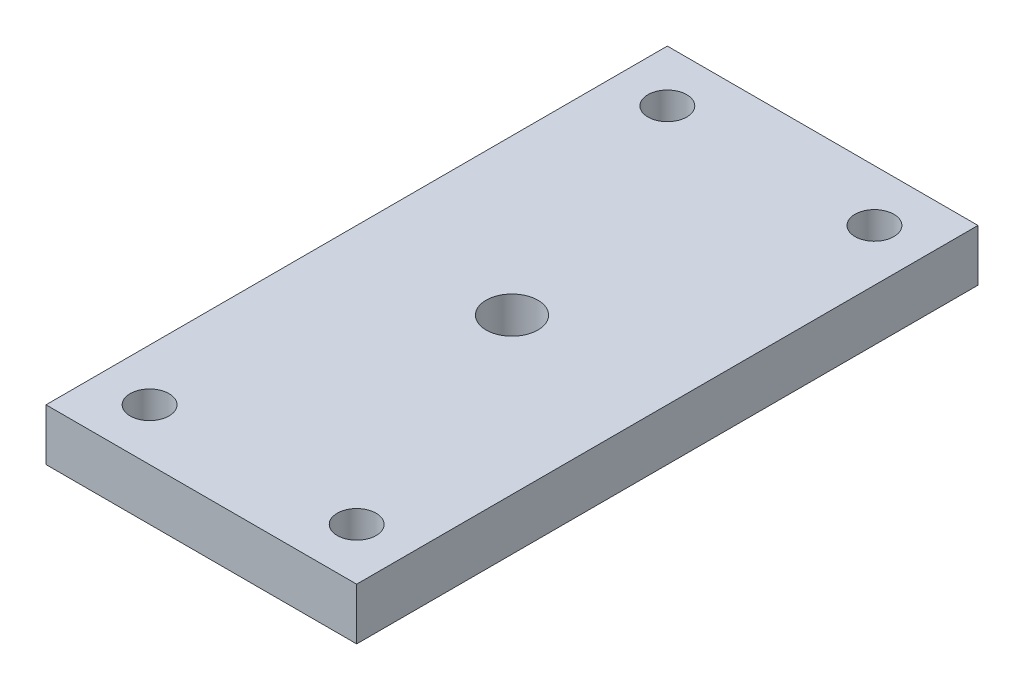
ISO-10303-21;
HEADER;
FILE_DESCRIPTION(('STEP AP214'),'2;1');
FILE_NAME('part.step','',(''),(''),'','','');
FILE_SCHEMA(('AUTOMOTIVE_DESIGN { 1 0 10303 214 1 1 1 1 }'));
ENDSEC;
DATA;
#1=APPLICATION_CONTEXT('core data for automotive mechanical design processes');
#2=APPLICATION_PROTOCOL_DEFINITION('international standard','automotive_design',2000,#1);
#3=PRODUCT_CONTEXT('',#1,'mechanical');
#4=PRODUCT('Part','Part','',(#3));
#5=PRODUCT_RELATED_PRODUCT_CATEGORY('part','',(#4));
#6=PRODUCT_DEFINITION_FORMATION('','',#4);
#7=PRODUCT_DEFINITION_CONTEXT('part definition',#1,'design');
#8=PRODUCT_DEFINITION('design','',#6,#7);
#9=PRODUCT_DEFINITION_SHAPE('','',#8);
#10=(LENGTH_UNIT() NAMED_UNIT(*) SI_UNIT(.MILLI.,.METRE.));
#11=(NAMED_UNIT(*) PLANE_ANGLE_UNIT() SI_UNIT($,.RADIAN.));
#12=(NAMED_UNIT(*) SI_UNIT($,.STERADIAN.) SOLID_ANGLE_UNIT());
#13=UNCERTAINTY_MEASURE_WITH_UNIT(LENGTH_MEASURE(1.E-05),#10,'distance_accuracy_value','');
#14=(GEOMETRIC_REPRESENTATION_CONTEXT(3) GLOBAL_UNCERTAINTY_ASSIGNED_CONTEXT((#13)) GLOBAL_UNIT_ASSIGNED_CONTEXT((#10,
#11,#12)) REPRESENTATION_CONTEXT('',''));
#15=CARTESIAN_POINT('',(0.,0.,0.));
#16=DIRECTION('',(0.,0.,1.));
#17=DIRECTION('',(1.,0.,0.));
#18=AXIS2_PLACEMENT_3D('',#15,#16,#17);
#19=CARTESIAN_POINT('',(0.,12.7,0.));
#20=DIRECTION('',(0.,1.,0.));
#21=DIRECTION('',(0.,0.,1.));
#22=AXIS2_PLACEMENT_3D('',#19,#20,#21);
#23=PLANE('',#22);
#24=CARTESIAN_POINT('',(25.4,12.7,-63.5));
#25=DIRECTION('',(0.,1.,0.));
#26=DIRECTION('',(0.,0.,1.));
#27=AXIS2_PLACEMENT_3D('',#24,#25,#26);
#28=CIRCLE('',#27,4.7625);
#29=CARTESIAN_POINT('',(25.4,12.7,-58.7375));
#30=VERTEX_POINT('',#29);
#31=EDGE_CURVE('E139',#30,#30,#28,.T.);
#32=ORIENTED_EDGE('',*,*,#31,.F.);
#33=EDGE_LOOP('',(#32));
#34=FACE_BOUND('',#33,.T.);
#35=CARTESIAN_POINT('',(25.4,12.7,63.5));
#36=DIRECTION('',(0.,1.,0.));
#37=DIRECTION('',(0.,0.,1.));
#38=AXIS2_PLACEMENT_3D('',#35,#36,#37);
#39=CIRCLE('',#38,4.7625);
#40=CARTESIAN_POINT('',(25.4,12.7,68.2625));
#41=VERTEX_POINT('',#40);
#42=EDGE_CURVE('E145',#41,#41,#39,.T.);
#43=ORIENTED_EDGE('',*,*,#42,.F.);
#44=EDGE_LOOP('',(#43));
#45=FACE_BOUND('',#44,.T.);
#46=CARTESIAN_POINT('',(-25.4,12.7,63.5));
#47=DIRECTION('',(0.,1.,0.));
#48=DIRECTION('',(0.,0.,1.));
#49=AXIS2_PLACEMENT_3D('',#46,#47,#48);
#50=CIRCLE('',#49,4.7625);
#51=CARTESIAN_POINT('',(-25.4,12.7,68.2625));
#52=VERTEX_POINT('',#51);
#53=EDGE_CURVE('E133',#52,#52,#50,.T.);
#54=ORIENTED_EDGE('',*,*,#53,.F.);
#55=EDGE_LOOP('',(#54));
#56=FACE_BOUND('',#55,.T.);
#57=CARTESIAN_POINT('',(-25.4,12.7,-63.5));
#58=DIRECTION('',(0.,1.,0.));
#59=DIRECTION('',(0.,0.,1.));
#60=AXIS2_PLACEMENT_3D('',#57,#58,#59);
#61=CIRCLE('',#60,4.7625);
#62=CARTESIAN_POINT('',(-25.4,12.7,-58.7375));
#63=VERTEX_POINT('',#62);
#64=EDGE_CURVE('E130',#63,#63,#61,.T.);
#65=ORIENTED_EDGE('',*,*,#64,.F.);
#66=EDGE_LOOP('',(#65));
#67=FACE_BOUND('',#66,.T.);
#68=DIRECTION('',(0.,0.,1.));
#69=VECTOR('',#68,1.);
#70=CARTESIAN_POINT('',(-38.1,12.7,76.1999999999999));
#71=LINE('',#70,#69);
#72=CARTESIAN_POINT('',(-38.1,12.7,-76.2000000000001));
#73=VERTEX_POINT('',#72);
#74=CARTESIAN_POINT('',(-38.1,12.7,76.1999999999999));
#75=VERTEX_POINT('',#74);
#76=EDGE_CURVE('E97',#73,#75,#71,.T.);
#77=ORIENTED_EDGE('',*,*,#76,.T.);
#78=DIRECTION('',(1.,0.,0.));
#79=VECTOR('',#78,1.);
#80=CARTESIAN_POINT('',(38.1,12.7,76.1999999999999));
#81=LINE('',#80,#79);
#82=CARTESIAN_POINT('',(38.1,12.7,76.1999999999999));
#83=VERTEX_POINT('',#82);
#84=EDGE_CURVE('E92',#75,#83,#81,.T.);
#85=ORIENTED_EDGE('',*,*,#84,.T.);
#86=DIRECTION('',(0.,0.,-1.));
#87=VECTOR('',#86,1.);
#88=CARTESIAN_POINT('',(38.1,12.7,76.1999999999999));
#89=LINE('',#88,#87);
#90=CARTESIAN_POINT('',(38.1,12.7,-76.2));
#91=VERTEX_POINT('',#90);
#92=EDGE_CURVE('E95',#83,#91,#89,.T.);
#93=ORIENTED_EDGE('',*,*,#92,.T.);
#94=DIRECTION('',(-1.,0.,0.));
#95=VECTOR('',#94,1.);
#96=CARTESIAN_POINT('',(38.1,12.7,-76.2));
#97=LINE('',#96,#95);
#98=EDGE_CURVE('E62',#91,#73,#97,.T.);
#99=ORIENTED_EDGE('',*,*,#98,.T.);
#100=EDGE_LOOP('',(#77,#85,#93,#99));
#101=FACE_BOUND('',#100,.T.);
#102=CARTESIAN_POINT('',(0.,12.7,0.));
#103=DIRECTION('',(0.,1.,0.));
#104=DIRECTION('',(0.,0.,1.));
#105=AXIS2_PLACEMENT_3D('',#102,#103,#104);
#106=CIRCLE('',#105,6.35);
#107=CARTESIAN_POINT('',(0.,12.7,6.34999999999999));
#108=VERTEX_POINT('',#107);
#109=EDGE_CURVE('E112',#108,#108,#106,.T.);
#110=ORIENTED_EDGE('',*,*,#109,.F.);
#111=EDGE_LOOP('',(#110));
#112=FACE_BOUND('',#111,.T.);
#113=ADVANCED_FACE('F45',(#34,#45,#56,#67,#101,#112),#23,.T.);
#114=CARTESIAN_POINT('',(0.,0.,0.));
#115=DIRECTION('',(0.,1.,0.));
#116=DIRECTION('',(0.,0.,1.));
#117=AXIS2_PLACEMENT_3D('',#114,#115,#116);
#118=PLANE('',#117);
#119=CARTESIAN_POINT('',(25.4,0.,-63.5));
#120=DIRECTION('',(0.,1.,0.));
#121=DIRECTION('',(0.,0.,1.));
#122=AXIS2_PLACEMENT_3D('',#119,#120,#121);
#123=CIRCLE('',#122,4.7625);
#124=CARTESIAN_POINT('',(25.4,0.,-58.7375));
#125=VERTEX_POINT('',#124);
#126=EDGE_CURVE('E136',#125,#125,#123,.T.);
#127=ORIENTED_EDGE('',*,*,#126,.T.);
#128=EDGE_LOOP('',(#127));
#129=FACE_BOUND('',#128,.T.);
#130=CARTESIAN_POINT('',(25.4,0.,63.5));
#131=DIRECTION('',(0.,1.,0.));
#132=DIRECTION('',(0.,0.,1.));
#133=AXIS2_PLACEMENT_3D('',#130,#131,#132);
#134=CIRCLE('',#133,4.7625);
#135=CARTESIAN_POINT('',(25.4,0.,68.2625));
#136=VERTEX_POINT('',#135);
#137=EDGE_CURVE('E142',#136,#136,#134,.T.);
#138=ORIENTED_EDGE('',*,*,#137,.T.);
#139=EDGE_LOOP('',(#138));
#140=FACE_BOUND('',#139,.T.);
#141=CARTESIAN_POINT('',(-25.4,0.,63.5));
#142=DIRECTION('',(0.,1.,0.));
#143=DIRECTION('',(0.,0.,1.));
#144=AXIS2_PLACEMENT_3D('',#141,#142,#143);
#145=CIRCLE('',#144,4.7625);
#146=CARTESIAN_POINT('',(-25.4,0.,68.2625));
#147=VERTEX_POINT('',#146);
#148=EDGE_CURVE('E148',#147,#147,#145,.T.);
#149=ORIENTED_EDGE('',*,*,#148,.T.);
#150=EDGE_LOOP('',(#149));
#151=FACE_BOUND('',#150,.T.);
#152=CARTESIAN_POINT('',(-25.4,0.,-63.5));
#153=DIRECTION('',(0.,1.,0.));
#154=DIRECTION('',(0.,0.,1.));
#155=AXIS2_PLACEMENT_3D('',#152,#153,#154);
#156=CIRCLE('',#155,4.7625);
#157=CARTESIAN_POINT('',(-25.4,0.,-58.7375));
#158=VERTEX_POINT('',#157);
#159=EDGE_CURVE('E127',#158,#158,#156,.T.);
#160=ORIENTED_EDGE('',*,*,#159,.T.);
#161=EDGE_LOOP('',(#160));
#162=FACE_BOUND('',#161,.T.);
#163=DIRECTION('',(0.,0.,1.));
#164=VECTOR('',#163,1.);
#165=CARTESIAN_POINT('',(-38.1,0.,76.1999999999999));
#166=LINE('',#165,#164);
#167=CARTESIAN_POINT('',(-38.1,0.,-76.2000000000001));
#168=VERTEX_POINT('',#167);
#169=CARTESIAN_POINT('',(-38.1,0.,76.1999999999999));
#170=VERTEX_POINT('',#169);
#171=EDGE_CURVE('E109',#168,#170,#166,.T.);
#172=ORIENTED_EDGE('',*,*,#171,.F.);
#173=DIRECTION('',(-1.,0.,0.));
#174=VECTOR('',#173,1.);
#175=CARTESIAN_POINT('',(38.1,0.,-76.2));
#176=LINE('',#175,#174);
#177=CARTESIAN_POINT('',(38.1,0.,-76.2));
#178=VERTEX_POINT('',#177);
#179=EDGE_CURVE('E85',#178,#168,#176,.T.);
#180=ORIENTED_EDGE('',*,*,#179,.F.);
#181=DIRECTION('',(0.,0.,-1.));
#182=VECTOR('',#181,1.);
#183=CARTESIAN_POINT('',(38.1,0.,76.1999999999999));
#184=LINE('',#183,#182);
#185=CARTESIAN_POINT('',(38.1,0.,76.1999999999999));
#186=VERTEX_POINT('',#185);
#187=EDGE_CURVE('E79',#186,#178,#184,.T.);
#188=ORIENTED_EDGE('',*,*,#187,.F.);
#189=DIRECTION('',(1.,0.,0.));
#190=VECTOR('',#189,1.);
#191=CARTESIAN_POINT('',(38.1,0.,76.1999999999999));
#192=LINE('',#191,#190);
#193=EDGE_CURVE('E101',#170,#186,#192,.T.);
#194=ORIENTED_EDGE('',*,*,#193,.F.);
#195=EDGE_LOOP('',(#172,#180,#188,#194));
#196=FACE_BOUND('',#195,.T.);
#197=CARTESIAN_POINT('',(0.,0.,0.));
#198=DIRECTION('',(0.,1.,0.));
#199=DIRECTION('',(0.,0.,1.));
#200=AXIS2_PLACEMENT_3D('',#197,#198,#199);
#201=CIRCLE('',#200,6.35);
#202=CARTESIAN_POINT('',(0.,0.,6.34999999999999));
#203=VERTEX_POINT('',#202);
#204=EDGE_CURVE('E124',#203,#203,#201,.T.);
#205=ORIENTED_EDGE('',*,*,#204,.T.);
#206=EDGE_LOOP('',(#205));
#207=FACE_BOUND('',#206,.T.);
#208=ADVANCED_FACE('F120',(#129,#140,#151,#162,#196,#207),#118,.F.);
#209=CARTESIAN_POINT('',(-38.1,12.7,76.1999999999999));
#210=DIRECTION('',(1.,0.,0.));
#211=DIRECTION('',(0.,0.,-1.));
#212=AXIS2_PLACEMENT_3D('',#209,#210,#211);
#213=PLANE('',#212);
#214=ORIENTED_EDGE('',*,*,#171,.T.);
#215=DIRECTION('',(0.,-1.,0.));
#216=VECTOR('',#215,1.);
#217=CARTESIAN_POINT('',(-38.1,12.7,76.1999999999999));
#218=LINE('',#217,#216);
#219=EDGE_CURVE('E11',#75,#170,#218,.T.);
#220=ORIENTED_EDGE('',*,*,#219,.F.);
#221=ORIENTED_EDGE('',*,*,#76,.F.);
#222=DIRECTION('',(0.,-1.,0.));
#223=VECTOR('',#222,1.);
#224=CARTESIAN_POINT('',(-38.1,12.7,-76.2000000000001));
#225=LINE('',#224,#223);
#226=EDGE_CURVE('E105',#73,#168,#225,.T.);
#227=ORIENTED_EDGE('',*,*,#226,.T.);
#228=EDGE_LOOP('',(#214,#220,#221,#227));
#229=FACE_BOUND('',#228,.T.);
#230=ADVANCED_FACE('F47',(#229),#213,.F.);
#231=CARTESIAN_POINT('',(38.1,12.7,76.1999999999999));
#232=DIRECTION('',(0.,0.,-1.));
#233=DIRECTION('',(-1.,0.,0.));
#234=AXIS2_PLACEMENT_3D('',#231,#232,#233);
#235=PLANE('',#234);
#236=ORIENTED_EDGE('',*,*,#193,.T.);
#237=DIRECTION('',(0.,-1.,0.));
#238=VECTOR('',#237,1.);
#239=CARTESIAN_POINT('',(38.1,12.7,76.1999999999999));
#240=LINE('',#239,#238);
#241=EDGE_CURVE('E54',#83,#186,#240,.T.);
#242=ORIENTED_EDGE('',*,*,#241,.F.);
#243=ORIENTED_EDGE('',*,*,#84,.F.);
#244=ORIENTED_EDGE('',*,*,#219,.T.);
#245=EDGE_LOOP('',(#236,#242,#243,#244));
#246=FACE_BOUND('',#245,.T.);
#247=ADVANCED_FACE('F100',(#246),#235,.F.);
#248=CARTESIAN_POINT('',(38.1,12.7,76.1999999999999));
#249=DIRECTION('',(-1.,0.,0.));
#250=DIRECTION('',(0.,0.,1.));
#251=AXIS2_PLACEMENT_3D('',#248,#249,#250);
#252=PLANE('',#251);
#253=ORIENTED_EDGE('',*,*,#187,.T.);
#254=DIRECTION('',(0.,-1.,0.));
#255=VECTOR('',#254,1.);
#256=CARTESIAN_POINT('',(38.1,12.7,-76.2));
#257=LINE('',#256,#255);
#258=EDGE_CURVE('E102',#91,#178,#257,.T.);
#259=ORIENTED_EDGE('',*,*,#258,.F.);
#260=ORIENTED_EDGE('',*,*,#92,.F.);
#261=ORIENTED_EDGE('',*,*,#241,.T.);
#262=EDGE_LOOP('',(#253,#259,#260,#261));
#263=FACE_BOUND('',#262,.T.);
#264=ADVANCED_FACE('F103',(#263),#252,.F.);
#265=CARTESIAN_POINT('',(38.1,12.7,-76.2));
#266=DIRECTION('',(0.,0.,1.));
#267=DIRECTION('',(1.,0.,0.));
#268=AXIS2_PLACEMENT_3D('',#265,#266,#267);
#269=PLANE('',#268);
#270=ORIENTED_EDGE('',*,*,#179,.T.);
#271=ORIENTED_EDGE('',*,*,#226,.F.);
#272=ORIENTED_EDGE('',*,*,#98,.F.);
#273=ORIENTED_EDGE('',*,*,#258,.T.);
#274=EDGE_LOOP('',(#270,#271,#272,#273));
#275=FACE_BOUND('',#274,.T.);
#276=ADVANCED_FACE('F117',(#275),#269,.F.);
#277=CARTESIAN_POINT('',(0.,12.7,0.));
#278=DIRECTION('',(0.,-1.,0.));
#279=DIRECTION('',(0.,0.,-1.));
#280=AXIS2_PLACEMENT_3D('',#277,#278,#279);
#281=CYLINDRICAL_SURFACE('',#280,6.35);
#282=ORIENTED_EDGE('',*,*,#109,.T.);
#283=EDGE_LOOP('',(#282));
#284=FACE_BOUND('',#283,.T.);
#285=ORIENTED_EDGE('',*,*,#204,.F.);
#286=EDGE_LOOP('',(#285));
#287=FACE_BOUND('',#286,.T.);
#288=ADVANCED_FACE('F164',(#284,#287),#281,.F.);
#289=CARTESIAN_POINT('',(-25.4,0.,-63.5));
#290=DIRECTION('',(0.,1.,0.));
#291=DIRECTION('',(0.,0.,1.));
#292=AXIS2_PLACEMENT_3D('',#289,#290,#291);
#293=CYLINDRICAL_SURFACE('',#292,4.7625);
#294=ORIENTED_EDGE('',*,*,#159,.F.);
#295=EDGE_LOOP('',(#294));
#296=FACE_BOUND('',#295,.T.);
#297=ORIENTED_EDGE('',*,*,#64,.T.);
#298=EDGE_LOOP('',(#297));
#299=FACE_BOUND('',#298,.T.);
#300=ADVANCED_FACE('F162',(#296,#299),#293,.F.);
#301=CARTESIAN_POINT('',(-25.4,0.,63.5));
#302=DIRECTION('',(0.,1.,0.));
#303=DIRECTION('',(0.,0.,1.));
#304=AXIS2_PLACEMENT_3D('',#301,#302,#303);
#305=CYLINDRICAL_SURFACE('',#304,4.7625);
#306=ORIENTED_EDGE('',*,*,#148,.F.);
#307=EDGE_LOOP('',(#306));
#308=FACE_BOUND('',#307,.T.);
#309=ORIENTED_EDGE('',*,*,#53,.T.);
#310=EDGE_LOOP('',(#309));
#311=FACE_BOUND('',#310,.T.);
#312=ADVANCED_FACE('F154',(#308,#311),#305,.F.);
#313=CARTESIAN_POINT('',(25.4,0.,63.5));
#314=DIRECTION('',(0.,1.,0.));
#315=DIRECTION('',(0.,0.,1.));
#316=AXIS2_PLACEMENT_3D('',#313,#314,#315);
#317=CYLINDRICAL_SURFACE('',#316,4.7625);
#318=ORIENTED_EDGE('',*,*,#137,.F.);
#319=EDGE_LOOP('',(#318));
#320=FACE_BOUND('',#319,.T.);
#321=ORIENTED_EDGE('',*,*,#42,.T.);
#322=EDGE_LOOP('',(#321));
#323=FACE_BOUND('',#322,.T.);
#324=ADVANCED_FACE('F171',(#320,#323),#317,.F.);
#325=CARTESIAN_POINT('',(25.4,0.,-63.5));
#326=DIRECTION('',(0.,1.,0.));
#327=DIRECTION('',(0.,0.,1.));
#328=AXIS2_PLACEMENT_3D('',#325,#326,#327);
#329=CYLINDRICAL_SURFACE('',#328,4.7625);
#330=ORIENTED_EDGE('',*,*,#126,.F.);
#331=EDGE_LOOP('',(#330));
#332=FACE_BOUND('',#331,.T.);
#333=ORIENTED_EDGE('',*,*,#31,.T.);
#334=EDGE_LOOP('',(#333));
#335=FACE_BOUND('',#334,.T.);
#336=ADVANCED_FACE('F179',(#332,#335),#329,.F.);
#337=CLOSED_SHELL('',(#113,#208,#230,#247,#264,#276,#288,#300,#312,#324,#336));
#338=MANIFOLD_SOLID_BREP('B2',#337);
#339=ADVANCED_BREP_SHAPE_REPRESENTATION('',(#18,#338),#14);
#340=SHAPE_DEFINITION_REPRESENTATION(#9,#339);
ENDSEC;
END-ISO-10303-21;
